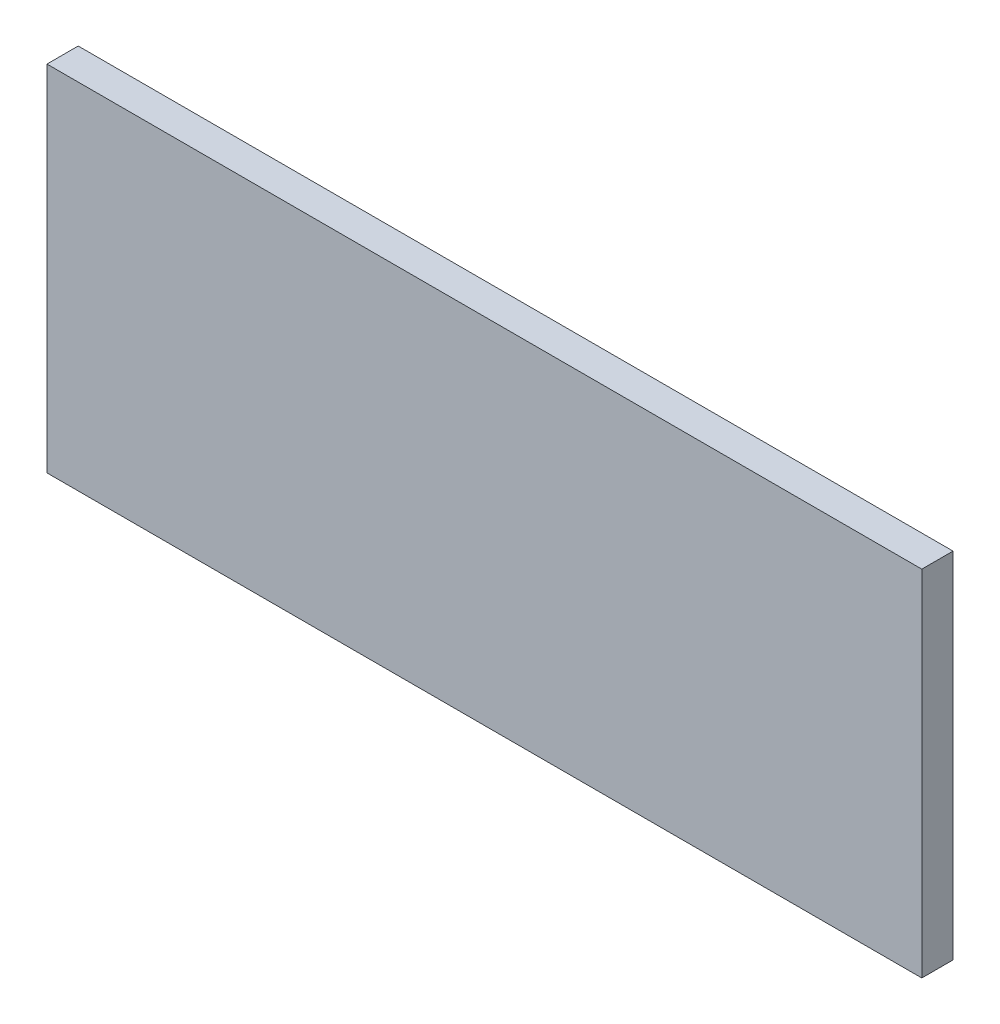
ISO-10303-21;
HEADER;
FILE_DESCRIPTION(('STEP AP214'),'2;1');
FILE_NAME('part.step','',(''),(''),'','','');
FILE_SCHEMA(('AUTOMOTIVE_DESIGN { 1 0 10303 214 1 1 1 1 }'));
ENDSEC;
DATA;
#1=APPLICATION_CONTEXT('core data for automotive mechanical design processes');
#2=APPLICATION_PROTOCOL_DEFINITION('international standard','automotive_design',2000,#1);
#3=PRODUCT_CONTEXT('',#1,'mechanical');
#4=PRODUCT('Part','Part','',(#3));
#5=PRODUCT_RELATED_PRODUCT_CATEGORY('part','',(#4));
#6=PRODUCT_DEFINITION_FORMATION('','',#4);
#7=PRODUCT_DEFINITION_CONTEXT('part definition',#1,'design');
#8=PRODUCT_DEFINITION('design','',#6,#7);
#9=PRODUCT_DEFINITION_SHAPE('','',#8);
#10=(LENGTH_UNIT() NAMED_UNIT(*) SI_UNIT(.MILLI.,.METRE.));
#11=(NAMED_UNIT(*) PLANE_ANGLE_UNIT() SI_UNIT($,.RADIAN.));
#12=(NAMED_UNIT(*) SI_UNIT($,.STERADIAN.) SOLID_ANGLE_UNIT());
#13=UNCERTAINTY_MEASURE_WITH_UNIT(LENGTH_MEASURE(1.E-05),#10,'distance_accuracy_value','');
#14=(GEOMETRIC_REPRESENTATION_CONTEXT(3) GLOBAL_UNCERTAINTY_ASSIGNED_CONTEXT((#13)) GLOBAL_UNIT_ASSIGNED_CONTEXT((#10,
#11,#12)) REPRESENTATION_CONTEXT('',''));
#15=CARTESIAN_POINT('',(0.,0.,0.));
#16=DIRECTION('',(0.,0.,1.));
#17=DIRECTION('',(1.,0.,0.));
#18=AXIS2_PLACEMENT_3D('',#15,#16,#17);
#19=CARTESIAN_POINT('',(84.,-34.,6.));
#20=DIRECTION('',(-1.,0.,0.));
#21=DIRECTION('',(0.,0.,1.));
#22=AXIS2_PLACEMENT_3D('',#19,#20,#21);
#23=PLANE('',#22);
#24=DIRECTION('',(0.,1.,0.));
#25=VECTOR('',#24,1.);
#26=CARTESIAN_POINT('',(84.,-34.,0.));
#27=LINE('',#26,#25);
#28=CARTESIAN_POINT('',(84.,-34.,0.));
#29=VERTEX_POINT('',#28);
#30=CARTESIAN_POINT('',(84.,34.,0.));
#31=VERTEX_POINT('',#30);
#32=EDGE_CURVE('E96',#29,#31,#27,.T.);
#33=ORIENTED_EDGE('',*,*,#32,.T.);
#34=DIRECTION('',(0.,0.,-1.));
#35=VECTOR('',#34,1.);
#36=CARTESIAN_POINT('',(84.,34.,6.));
#37=LINE('',#36,#35);
#38=CARTESIAN_POINT('',(84.,34.,6.));
#39=VERTEX_POINT('',#38);
#40=EDGE_CURVE('E11',#39,#31,#37,.T.);
#41=ORIENTED_EDGE('',*,*,#40,.F.);
#42=DIRECTION('',(0.,1.,0.));
#43=VECTOR('',#42,1.);
#44=CARTESIAN_POINT('',(84.,-34.,6.));
#45=LINE('',#44,#43);
#46=CARTESIAN_POINT('',(84.,-34.,6.));
#47=VERTEX_POINT('',#46);
#48=EDGE_CURVE('E84',#47,#39,#45,.T.);
#49=ORIENTED_EDGE('',*,*,#48,.F.);
#50=DIRECTION('',(0.,0.,-1.));
#51=VECTOR('',#50,1.);
#52=CARTESIAN_POINT('',(84.,-34.,6.));
#53=LINE('',#52,#51);
#54=EDGE_CURVE('E92',#47,#29,#53,.T.);
#55=ORIENTED_EDGE('',*,*,#54,.T.);
#56=EDGE_LOOP('',(#33,#41,#49,#55));
#57=FACE_BOUND('',#56,.T.);
#58=ADVANCED_FACE('F33',(#57),#23,.F.);
#59=CARTESIAN_POINT('',(-84.,34.,6.));
#60=DIRECTION('',(0.,-1.,0.));
#61=DIRECTION('',(0.,0.,-1.));
#62=AXIS2_PLACEMENT_3D('',#59,#60,#61);
#63=PLANE('',#62);
#64=DIRECTION('',(-1.,0.,0.));
#65=VECTOR('',#64,1.);
#66=CARTESIAN_POINT('',(-84.,34.,0.));
#67=LINE('',#66,#65);
#68=CARTESIAN_POINT('',(-84.,34.,0.));
#69=VERTEX_POINT('',#68);
#70=EDGE_CURVE('E88',#31,#69,#67,.T.);
#71=ORIENTED_EDGE('',*,*,#70,.T.);
#72=DIRECTION('',(0.,0.,-1.));
#73=VECTOR('',#72,1.);
#74=CARTESIAN_POINT('',(-84.,34.,6.));
#75=LINE('',#74,#73);
#76=CARTESIAN_POINT('',(-84.,34.,6.));
#77=VERTEX_POINT('',#76);
#78=EDGE_CURVE('E41',#77,#69,#75,.T.);
#79=ORIENTED_EDGE('',*,*,#78,.F.);
#80=DIRECTION('',(-1.,0.,0.));
#81=VECTOR('',#80,1.);
#82=CARTESIAN_POINT('',(-84.,34.,6.));
#83=LINE('',#82,#81);
#84=EDGE_CURVE('E79',#39,#77,#83,.T.);
#85=ORIENTED_EDGE('',*,*,#84,.F.);
#86=ORIENTED_EDGE('',*,*,#40,.T.);
#87=EDGE_LOOP('',(#71,#79,#85,#86));
#88=FACE_BOUND('',#87,.T.);
#89=ADVANCED_FACE('F87',(#88),#63,.F.);
#90=CARTESIAN_POINT('',(-84.,-34.,6.));
#91=DIRECTION('',(1.,0.,0.));
#92=DIRECTION('',(0.,0.,-1.));
#93=AXIS2_PLACEMENT_3D('',#90,#91,#92);
#94=PLANE('',#93);
#95=DIRECTION('',(0.,-1.,0.));
#96=VECTOR('',#95,1.);
#97=CARTESIAN_POINT('',(-84.,-34.,0.));
#98=LINE('',#97,#96);
#99=CARTESIAN_POINT('',(-84.,-34.,0.));
#100=VERTEX_POINT('',#99);
#101=EDGE_CURVE('E66',#69,#100,#98,.T.);
#102=ORIENTED_EDGE('',*,*,#101,.T.);
#103=DIRECTION('',(0.,0.,-1.));
#104=VECTOR('',#103,1.);
#105=CARTESIAN_POINT('',(-84.,-34.,6.));
#106=LINE('',#105,#104);
#107=CARTESIAN_POINT('',(-84.,-34.,6.));
#108=VERTEX_POINT('',#107);
#109=EDGE_CURVE('E89',#108,#100,#106,.T.);
#110=ORIENTED_EDGE('',*,*,#109,.F.);
#111=DIRECTION('',(0.,-1.,0.));
#112=VECTOR('',#111,1.);
#113=CARTESIAN_POINT('',(-84.,-34.,6.));
#114=LINE('',#113,#112);
#115=EDGE_CURVE('E82',#77,#108,#114,.T.);
#116=ORIENTED_EDGE('',*,*,#115,.F.);
#117=ORIENTED_EDGE('',*,*,#78,.T.);
#118=EDGE_LOOP('',(#102,#110,#116,#117));
#119=FACE_BOUND('',#118,.T.);
#120=ADVANCED_FACE('F90',(#119),#94,.F.);
#121=CARTESIAN_POINT('',(-84.,-34.,6.));
#122=DIRECTION('',(0.,1.,0.));
#123=DIRECTION('',(0.,0.,1.));
#124=AXIS2_PLACEMENT_3D('',#121,#122,#123);
#125=PLANE('',#124);
#126=DIRECTION('',(1.,0.,0.));
#127=VECTOR('',#126,1.);
#128=CARTESIAN_POINT('',(-84.,-34.,0.));
#129=LINE('',#128,#127);
#130=EDGE_CURVE('E72',#100,#29,#129,.T.);
#131=ORIENTED_EDGE('',*,*,#130,.T.);
#132=ORIENTED_EDGE('',*,*,#54,.F.);
#133=DIRECTION('',(1.,0.,0.));
#134=VECTOR('',#133,1.);
#135=CARTESIAN_POINT('',(-84.,-34.,6.));
#136=LINE('',#135,#134);
#137=EDGE_CURVE('E49',#108,#47,#136,.T.);
#138=ORIENTED_EDGE('',*,*,#137,.F.);
#139=ORIENTED_EDGE('',*,*,#109,.T.);
#140=EDGE_LOOP('',(#131,#132,#138,#139));
#141=FACE_BOUND('',#140,.T.);
#142=ADVANCED_FACE('F103',(#141),#125,.F.);
#143=CARTESIAN_POINT('',(0.,0.,6.));
#144=DIRECTION('',(0.,0.,-1.));
#145=DIRECTION('',(-1.,0.,0.));
#146=AXIS2_PLACEMENT_3D('',#143,#144,#145);
#147=PLANE('',#146);
#148=ORIENTED_EDGE('',*,*,#48,.T.);
#149=ORIENTED_EDGE('',*,*,#84,.T.);
#150=ORIENTED_EDGE('',*,*,#115,.T.);
#151=ORIENTED_EDGE('',*,*,#137,.T.);
#152=EDGE_LOOP('',(#148,#149,#150,#151));
#153=FACE_BOUND('',#152,.T.);
#154=ADVANCED_FACE('F80',(#153),#147,.F.);
#155=CARTESIAN_POINT('',(0.,0.,0.));
#156=DIRECTION('',(0.,0.,-1.));
#157=DIRECTION('',(-1.,0.,0.));
#158=AXIS2_PLACEMENT_3D('',#155,#156,#157);
#159=PLANE('',#158);
#160=ORIENTED_EDGE('',*,*,#32,.F.);
#161=ORIENTED_EDGE('',*,*,#130,.F.);
#162=ORIENTED_EDGE('',*,*,#101,.F.);
#163=ORIENTED_EDGE('',*,*,#70,.F.);
#164=EDGE_LOOP('',(#160,#161,#162,#163));
#165=FACE_BOUND('',#164,.T.);
#166=ADVANCED_FACE('F106',(#165),#159,.T.);
#167=CLOSED_SHELL('',(#58,#89,#120,#142,#154,#166));
#168=MANIFOLD_SOLID_BREP('B2',#167);
#169=ADVANCED_BREP_SHAPE_REPRESENTATION('',(#18,#168),#14);
#170=SHAPE_DEFINITION_REPRESENTATION(#9,#169);
ENDSEC;
END-ISO-10303-21;
